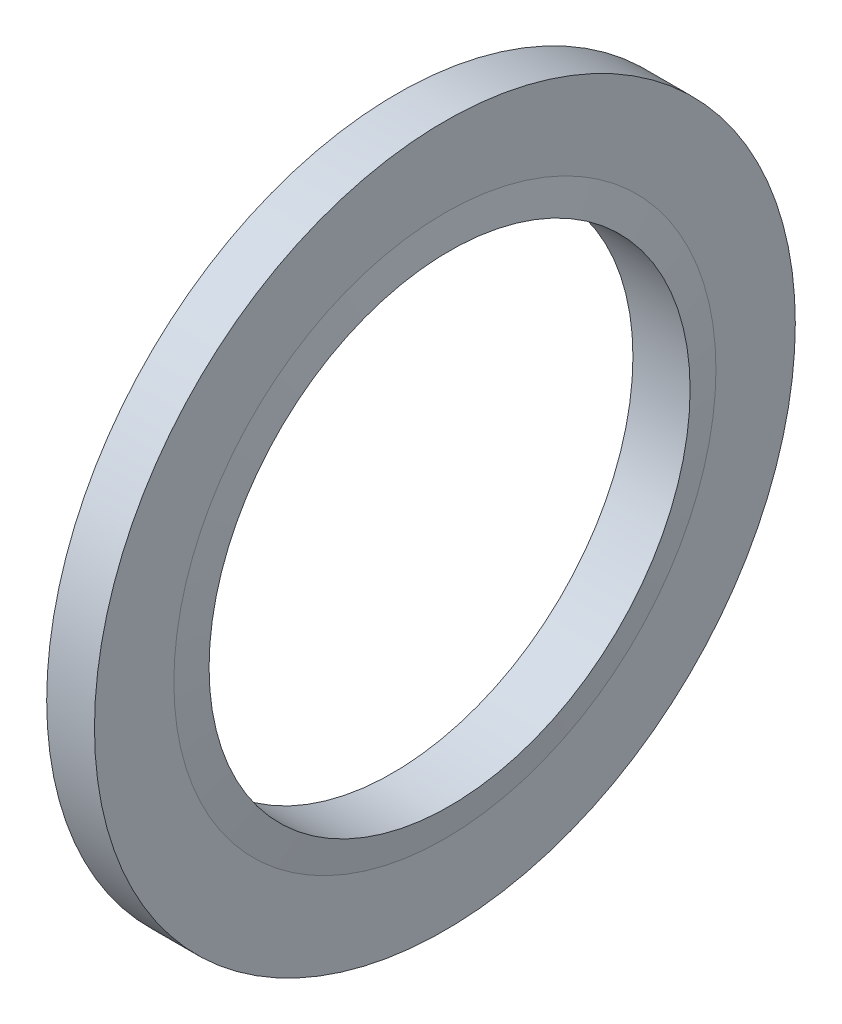
ISO-10303-21;
HEADER;
FILE_DESCRIPTION(('STEP AP214'),'2;1');
FILE_NAME('part.step','',(''),(''),'','','');
FILE_SCHEMA(('AUTOMOTIVE_DESIGN { 1 0 10303 214 1 1 1 1 }'));
ENDSEC;
DATA;
#1=APPLICATION_CONTEXT('core data for automotive mechanical design processes');
#2=APPLICATION_PROTOCOL_DEFINITION('international standard','automotive_design',2000,#1);
#3=PRODUCT_CONTEXT('',#1,'mechanical');
#4=PRODUCT('Part','Part','',(#3));
#5=PRODUCT_RELATED_PRODUCT_CATEGORY('part','',(#4));
#6=PRODUCT_DEFINITION_FORMATION('','',#4);
#7=PRODUCT_DEFINITION_CONTEXT('part definition',#1,'design');
#8=PRODUCT_DEFINITION('design','',#6,#7);
#9=PRODUCT_DEFINITION_SHAPE('','',#8);
#10=(LENGTH_UNIT() NAMED_UNIT(*) SI_UNIT(.MILLI.,.METRE.));
#11=(NAMED_UNIT(*) PLANE_ANGLE_UNIT() SI_UNIT($,.RADIAN.));
#12=(NAMED_UNIT(*) SI_UNIT($,.STERADIAN.) SOLID_ANGLE_UNIT());
#13=UNCERTAINTY_MEASURE_WITH_UNIT(LENGTH_MEASURE(1.E-05),#10,'distance_accuracy_value','');
#14=(GEOMETRIC_REPRESENTATION_CONTEXT(3) GLOBAL_UNCERTAINTY_ASSIGNED_CONTEXT((#13)) GLOBAL_UNIT_ASSIGNED_CONTEXT((#10,
#11,#12)) REPRESENTATION_CONTEXT('',''));
#15=CARTESIAN_POINT('',(0.,0.,0.));
#16=DIRECTION('',(0.,0.,1.));
#17=DIRECTION('',(1.,0.,0.));
#18=AXIS2_PLACEMENT_3D('',#15,#16,#17);
#19=CARTESIAN_POINT('',(0.178125,0.,0.));
#20=DIRECTION('',(1.,0.,0.));
#21=DIRECTION('',(0.,0.,-1.));
#22=AXIS2_PLACEMENT_3D('',#19,#20,#21);
#23=CONICAL_SURFACE('',#22,8.508484961,1.41823423721795);
#24=CARTESIAN_POINT('',(0.178125,0.,0.));
#25=DIRECTION('',(1.,0.,0.));
#26=DIRECTION('',(0.,0.,-1.));
#27=AXIS2_PLACEMENT_3D('',#24,#25,#26);
#28=CIRCLE('',#27,8.508484961);
#29=CARTESIAN_POINT('',(0.178125,0.,-8.508484961));
#30=VERTEX_POINT('',#29);
#31=EDGE_CURVE('E71',#30,#30,#28,.T.);
#32=ORIENTED_EDGE('',*,*,#31,.F.);
#33=EDGE_LOOP('',(#32));
#34=FACE_BOUND('',#33,.T.);
#35=CARTESIAN_POINT('',(0.0307513702804121,0.,0.));
#36=DIRECTION('',(1.,0.,0.));
#37=DIRECTION('',(0.,0.,-1.));
#38=AXIS2_PLACEMENT_3D('',#35,#36,#37);
#39=CIRCLE('',#38,7.55);
#40=CARTESIAN_POINT('',(0.0307513702804121,0.,-7.55));
#41=VERTEX_POINT('',#40);
#42=EDGE_CURVE('E75',#41,#41,#39,.T.);
#43=ORIENTED_EDGE('',*,*,#42,.T.);
#44=EDGE_LOOP('',(#43));
#45=FACE_BOUND('',#44,.T.);
#46=ADVANCED_FACE('F50',(#34,#45),#23,.T.);
#47=CARTESIAN_POINT('',(1.85625,0.,0.));
#48=DIRECTION('',(-1.,0.,0.));
#49=DIRECTION('',(0.,0.,1.));
#50=AXIS2_PLACEMENT_3D('',#47,#48,#49);
#51=CONICAL_SURFACE('',#50,7.35,1.41823423721795);
#52=CARTESIAN_POINT('',(1.678125,0.,0.));
#53=DIRECTION('',(1.,0.,0.));
#54=DIRECTION('',(0.,0.,-1.));
#55=AXIS2_PLACEMENT_3D('',#52,#53,#54);
#56=CIRCLE('',#55,8.508484961);
#57=CARTESIAN_POINT('',(1.678125,0.,-8.508484961));
#58=VERTEX_POINT('',#57);
#59=EDGE_CURVE('E12',#58,#58,#56,.T.);
#60=ORIENTED_EDGE('',*,*,#59,.T.);
#61=EDGE_LOOP('',(#60));
#62=FACE_BOUND('',#61,.T.);
#63=CARTESIAN_POINT('',(1.82549862971959,0.,0.));
#64=DIRECTION('',(-1.,0.,0.));
#65=DIRECTION('',(0.,0.,1.));
#66=AXIS2_PLACEMENT_3D('',#63,#64,#65);
#67=CIRCLE('',#66,7.55);
#68=CARTESIAN_POINT('',(1.82549862971959,0.,7.55));
#69=VERTEX_POINT('',#68);
#70=EDGE_CURVE('E54',#69,#69,#67,.T.);
#71=ORIENTED_EDGE('',*,*,#70,.T.);
#72=EDGE_LOOP('',(#71));
#73=FACE_BOUND('',#72,.T.);
#74=ADVANCED_FACE('F52',(#62,#73),#51,.T.);
#75=CARTESIAN_POINT('',(0.178125,11.,0.));
#76=DIRECTION('',(-1.,0.,0.));
#77=DIRECTION('',(0.,0.,1.));
#78=AXIS2_PLACEMENT_3D('',#75,#76,#77);
#79=PLANE('',#78);
#80=ORIENTED_EDGE('',*,*,#31,.T.);
#81=EDGE_LOOP('',(#80));
#82=FACE_BOUND('',#81,.T.);
#83=CARTESIAN_POINT('',(0.178125,0.,0.));
#84=DIRECTION('',(1.,0.,0.));
#85=DIRECTION('',(0.,0.,-1.));
#86=AXIS2_PLACEMENT_3D('',#83,#84,#85);
#87=CIRCLE('',#86,11.);
#88=CARTESIAN_POINT('',(0.178125,0.,-11.));
#89=VERTEX_POINT('',#88);
#90=EDGE_CURVE('E65',#89,#89,#87,.T.);
#91=ORIENTED_EDGE('',*,*,#90,.F.);
#92=EDGE_LOOP('',(#91));
#93=FACE_BOUND('',#92,.T.);
#94=ADVANCED_FACE('F103',(#82,#93),#79,.T.);
#95=CARTESIAN_POINT('',(1.85625,0.,0.));
#96=DIRECTION('',(1.,0.,0.));
#97=DIRECTION('',(0.,0.,-1.));
#98=AXIS2_PLACEMENT_3D('',#95,#96,#97);
#99=CYLINDRICAL_SURFACE('',#98,11.);
#100=ORIENTED_EDGE('',*,*,#90,.T.);
#101=EDGE_LOOP('',(#100));
#102=FACE_BOUND('',#101,.T.);
#103=CARTESIAN_POINT('',(1.678125,0.,0.));
#104=DIRECTION('',(1.,0.,0.));
#105=DIRECTION('',(0.,0.,-1.));
#106=AXIS2_PLACEMENT_3D('',#103,#104,#105);
#107=CIRCLE('',#106,11.);
#108=CARTESIAN_POINT('',(1.678125,0.,-11.));
#109=VERTEX_POINT('',#108);
#110=EDGE_CURVE('E59',#109,#109,#107,.T.);
#111=ORIENTED_EDGE('',*,*,#110,.F.);
#112=EDGE_LOOP('',(#111));
#113=FACE_BOUND('',#112,.T.);
#114=ADVANCED_FACE('F95',(#102,#113),#99,.T.);
#115=CARTESIAN_POINT('',(1.678125,8.508484961,0.));
#116=DIRECTION('',(1.,0.,0.));
#117=DIRECTION('',(0.,0.,-1.));
#118=AXIS2_PLACEMENT_3D('',#115,#116,#117);
#119=PLANE('',#118);
#120=ORIENTED_EDGE('',*,*,#110,.T.);
#121=EDGE_LOOP('',(#120));
#122=FACE_BOUND('',#121,.T.);
#123=ORIENTED_EDGE('',*,*,#59,.F.);
#124=EDGE_LOOP('',(#123));
#125=FACE_BOUND('',#124,.T.);
#126=ADVANCED_FACE('F89',(#122,#125),#119,.T.);
#127=CARTESIAN_POINT('',(11.678125,0.,0.));
#128=DIRECTION('',(-1.,0.,0.));
#129=DIRECTION('',(0.,0.,1.));
#130=AXIS2_PLACEMENT_3D('',#127,#128,#129);
#131=CYLINDRICAL_SURFACE('',#130,7.55);
#132=ORIENTED_EDGE('',*,*,#42,.F.);
#133=EDGE_LOOP('',(#132));
#134=FACE_BOUND('',#133,.T.);
#135=ORIENTED_EDGE('',*,*,#70,.F.);
#136=EDGE_LOOP('',(#135));
#137=FACE_BOUND('',#136,.T.);
#138=ADVANCED_FACE('F87',(#134,#137),#131,.F.);
#139=CLOSED_SHELL('',(#46,#74,#94,#114,#126,#138));
#140=MANIFOLD_SOLID_BREP('B2',#139);
#141=ADVANCED_BREP_SHAPE_REPRESENTATION('',(#18,#140),#14);
#142=SHAPE_DEFINITION_REPRESENTATION(#9,#141);
ENDSEC;
END-ISO-10303-21;
